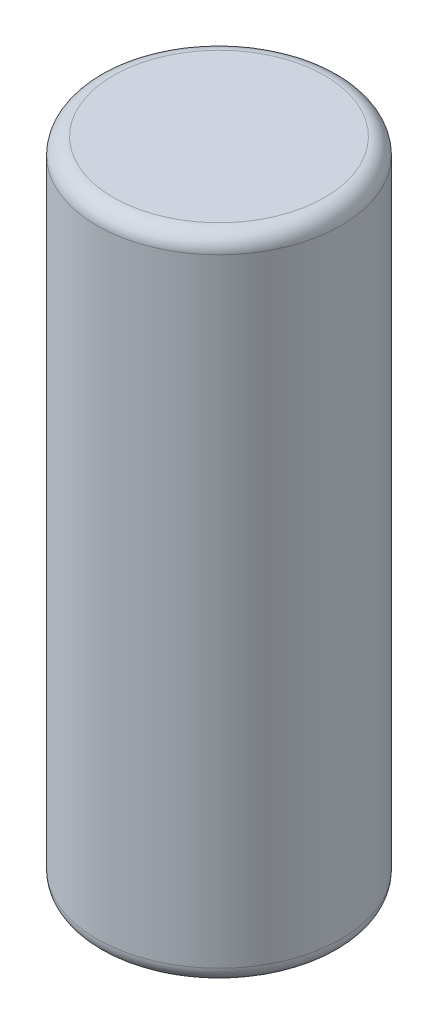
ISO-10303-21;
HEADER;
FILE_DESCRIPTION(('STEP AP214'),'2;1');
FILE_NAME('part.step','',(''),(''),'','','');
FILE_SCHEMA(('AUTOMOTIVE_DESIGN { 1 0 10303 214 1 1 1 1 }'));
ENDSEC;
DATA;
#1=APPLICATION_CONTEXT('core data for automotive mechanical design processes');
#2=APPLICATION_PROTOCOL_DEFINITION('international standard','automotive_design',2000,#1);
#3=PRODUCT_CONTEXT('',#1,'mechanical');
#4=PRODUCT('Part','Part','',(#3));
#5=PRODUCT_RELATED_PRODUCT_CATEGORY('part','',(#4));
#6=PRODUCT_DEFINITION_FORMATION('','',#4);
#7=PRODUCT_DEFINITION_CONTEXT('part definition',#1,'design');
#8=PRODUCT_DEFINITION('design','',#6,#7);
#9=PRODUCT_DEFINITION_SHAPE('','',#8);
#10=(LENGTH_UNIT() NAMED_UNIT(*) SI_UNIT(.MILLI.,.METRE.));
#11=(NAMED_UNIT(*) PLANE_ANGLE_UNIT() SI_UNIT($,.RADIAN.));
#12=(NAMED_UNIT(*) SI_UNIT($,.STERADIAN.) SOLID_ANGLE_UNIT());
#13=UNCERTAINTY_MEASURE_WITH_UNIT(LENGTH_MEASURE(1.E-05),#10,'distance_accuracy_value','');
#14=(GEOMETRIC_REPRESENTATION_CONTEXT(3) GLOBAL_UNCERTAINTY_ASSIGNED_CONTEXT((#13)) GLOBAL_UNIT_ASSIGNED_CONTEXT((#10,
#11,#12)) REPRESENTATION_CONTEXT('',''));
#15=CARTESIAN_POINT('',(0.,0.,0.));
#16=DIRECTION('',(0.,0.,1.));
#17=DIRECTION('',(1.,0.,0.));
#18=AXIS2_PLACEMENT_3D('',#15,#16,#17);
#19=CARTESIAN_POINT('',(0.,200.,0.));
#20=DIRECTION('',(0.,-1.,0.));
#21=DIRECTION('',(0.,0.,-1.));
#22=AXIS2_PLACEMENT_3D('',#19,#20,#21);
#23=CYLINDRICAL_SURFACE('',#22,75.);
#24=CARTESIAN_POINT('',(0.,-190.,0.));
#25=DIRECTION('',(0.,1.,0.));
#26=DIRECTION('',(0.,0.,1.));
#27=AXIS2_PLACEMENT_3D('',#24,#25,#26);
#28=CIRCLE('',#27,75.);
#29=CARTESIAN_POINT('',(0.,-190.,-75.));
#30=VERTEX_POINT('',#29);
#31=EDGE_CURVE('E45',#30,#30,#28,.T.);
#32=CARTESIAN_POINT('',(0.,190.,0.));
#33=DIRECTION('',(0.,1.,0.));
#34=DIRECTION('',(0.,0.,1.));
#35=AXIS2_PLACEMENT_3D('',#32,#33,#34);
#36=CIRCLE('',#35,75.);
#37=CARTESIAN_POINT('',(0.,190.,-75.));
#38=VERTEX_POINT('',#37);
#39=EDGE_CURVE('E49',#38,#38,#36,.F.);
#40=CARTESIAN_POINT('',(0.,-190.,-75.));
#41=CARTESIAN_POINT('',(0.,-186.041666666667,-75.));
#42=CARTESIAN_POINT('',(0.,-182.083333333334,-75.));
#43=CARTESIAN_POINT('',(0.,-174.166666666667,-75.));
#44=CARTESIAN_POINT('',(0.,-170.208333333333,-75.));
#45=CARTESIAN_POINT('',(0.,-162.291666666667,-75.));
#46=CARTESIAN_POINT('',(0.,-158.333333333333,-75.));
#47=CARTESIAN_POINT('',(0.,-150.416666666667,-75.));
#48=CARTESIAN_POINT('',(0.,-146.458333333333,-75.));
#49=CARTESIAN_POINT('',(0.,-138.541666666667,-75.));
#50=CARTESIAN_POINT('',(0.,-134.583333333333,-75.));
#51=CARTESIAN_POINT('',(0.,-126.666666666667,-75.));
#52=CARTESIAN_POINT('',(0.,-122.708333333333,-75.));
#53=CARTESIAN_POINT('',(0.,-114.791666666667,-75.));
#54=CARTESIAN_POINT('',(0.,-110.833333333333,-75.));
#55=CARTESIAN_POINT('',(0.,-102.916666666667,-75.));
#56=CARTESIAN_POINT('',(0.,-98.9583333333335,-75.));
#57=CARTESIAN_POINT('',(0.,-91.0416666666668,-75.));
#58=CARTESIAN_POINT('',(0.,-87.0833333333334,-75.));
#59=CARTESIAN_POINT('',(0.,-79.1666666666667,-75.));
#60=CARTESIAN_POINT('',(0.,-75.2083333333334,-75.));
#61=CARTESIAN_POINT('',(0.,-67.2916666666667,-75.));
#62=CARTESIAN_POINT('',(0.,-63.3333333333334,-75.));
#63=CARTESIAN_POINT('',(0.,-55.4166666666668,-75.));
#64=CARTESIAN_POINT('',(0.,-51.4583333333334,-75.));
#65=CARTESIAN_POINT('',(0.,-43.5416666666668,-75.));
#66=CARTESIAN_POINT('',(0.,-39.5833333333334,-75.));
#67=CARTESIAN_POINT('',(0.,-31.6666666666667,-75.));
#68=CARTESIAN_POINT('',(0.,-27.7083333333334,-75.));
#69=CARTESIAN_POINT('',(0.,-19.7916666666667,-75.));
#70=CARTESIAN_POINT('',(0.,-15.8333333333334,-75.));
#71=CARTESIAN_POINT('',(0.,-7.91666666666674,-75.));
#72=CARTESIAN_POINT('',(0.,-3.9583333333334,-75.));
#73=CARTESIAN_POINT('',(0.,3.95833333333328,-75.));
#74=CARTESIAN_POINT('',(0.,7.91666666666663,-75.));
#75=CARTESIAN_POINT('',(0.,15.8333333333333,-75.));
#76=CARTESIAN_POINT('',(0.,19.7916666666666,-75.));
#77=CARTESIAN_POINT('',(0.,27.7083333333333,-75.));
#78=CARTESIAN_POINT('',(0.,31.6666666666666,-75.));
#79=CARTESIAN_POINT('',(0.,39.5833333333333,-75.));
#80=CARTESIAN_POINT('',(0.,43.5416666666666,-75.));
#81=CARTESIAN_POINT('',(0.,51.4583333333333,-75.));
#82=CARTESIAN_POINT('',(0.,55.4166666666667,-75.));
#83=CARTESIAN_POINT('',(0.,63.3333333333333,-75.));
#84=CARTESIAN_POINT('',(0.,67.2916666666667,-75.));
#85=CARTESIAN_POINT('',(0.,75.2083333333333,-75.));
#86=CARTESIAN_POINT('',(0.,79.1666666666666,-75.));
#87=CARTESIAN_POINT('',(0.,87.0833333333333,-75.));
#88=CARTESIAN_POINT('',(0.,91.0416666666667,-75.));
#89=CARTESIAN_POINT('',(0.,98.9583333333334,-75.));
#90=CARTESIAN_POINT('',(0.,102.916666666667,-75.));
#91=CARTESIAN_POINT('',(0.,110.833333333333,-75.));
#92=CARTESIAN_POINT('',(0.,114.791666666667,-75.));
#93=CARTESIAN_POINT('',(0.,122.708333333333,-75.));
#94=CARTESIAN_POINT('',(0.,126.666666666667,-75.));
#95=CARTESIAN_POINT('',(0.,134.583333333333,-75.));
#96=CARTESIAN_POINT('',(0.,138.541666666667,-75.));
#97=CARTESIAN_POINT('',(0.,146.458333333333,-75.));
#98=CARTESIAN_POINT('',(0.,150.416666666667,-75.));
#99=CARTESIAN_POINT('',(0.,158.333333333333,-75.));
#100=CARTESIAN_POINT('',(0.,162.291666666667,-75.));
#101=CARTESIAN_POINT('',(0.,170.208333333333,-75.));
#102=CARTESIAN_POINT('',(0.,174.166666666667,-75.));
#103=CARTESIAN_POINT('',(0.,182.083333333333,-75.));
#104=CARTESIAN_POINT('',(0.,186.041666666667,-75.));
#105=CARTESIAN_POINT('',(0.,190.,-75.));
#106=B_SPLINE_CURVE_WITH_KNOTS('',3,(#40,#41,#42,#43,#44,#45,#46,#47,#48,#49,#50,#51,#52,#53,
#54,#55,#56,#57,#58,#59,#60,#61,#62,#63,#64,#65,#66,#67,#68,#69,#70,#71,#72,#73,#74,#75,#76,#77,
#78,#79,#80,#81,#82,#83,#84,#85,#86,#87,#88,#89,#90,#91,#92,#93,#94,#95,#96,#97,#98,#99,#100,
#101,#102,#103,#104,#105),.UNSPECIFIED.,.F.,.F.,(4,2,2,2,2,2,2,2,2,2,2,2,2,2,2,2,2,2,2,2,2,2,2,
2,2,2,2,2,2,2,2,2,4),(0.,11.875,23.75,35.625,47.5,59.3750000000001,71.25,83.1250000000001,
95.0000000000001,106.875,118.75,130.625,142.5,154.375,166.25,178.125,190.,201.875,213.75,
225.625,237.5,249.375,261.25,273.125,285.,296.875,308.75,320.625,332.5,344.375,356.25,368.125,
380.),.UNSPECIFIED.);
#107=EDGE_CURVE('BSEAM34',#30,#38,#106,.T.);
#108=ORIENTED_EDGE('',*,*,#31,.T.);
#109=ORIENTED_EDGE('',*,*,#39,.T.);
#110=ORIENTED_EDGE('',*,*,#107,.T.);
#111=ORIENTED_EDGE('',*,*,#107,.F.);
#112=EDGE_LOOP('',(#108,#110,#109,#111));
#113=FACE_BOUND('',#112,.T.);
#114=ADVANCED_FACE('F34',(#113),#23,.T.);
#115=CARTESIAN_POINT('',(0.,200.,0.));
#116=DIRECTION('',(0.,1.,0.));
#117=DIRECTION('',(0.,0.,1.));
#118=AXIS2_PLACEMENT_3D('',#115,#116,#117);
#119=PLANE('',#118);
#120=CARTESIAN_POINT('',(0.,200.,0.));
#121=DIRECTION('',(0.,1.,0.));
#122=DIRECTION('',(0.,0.,1.));
#123=AXIS2_PLACEMENT_3D('',#120,#121,#122);
#124=CIRCLE('',#123,65.);
#125=CARTESIAN_POINT('',(0.,200.,65.));
#126=VERTEX_POINT('',#125);
#127=EDGE_CURVE('E10',#126,#126,#124,.T.);
#128=ORIENTED_EDGE('',*,*,#127,.T.);
#129=EDGE_LOOP('',(#128));
#130=FACE_BOUND('',#129,.T.);
#131=ADVANCED_FACE('F65',(#130),#119,.T.);
#132=CARTESIAN_POINT('',(0.,-200.,0.));
#133=DIRECTION('',(0.,1.,0.));
#134=DIRECTION('',(0.,0.,1.));
#135=AXIS2_PLACEMENT_3D('',#132,#133,#134);
#136=PLANE('',#135);
#137=CARTESIAN_POINT('',(0.,-200.,0.));
#138=DIRECTION('',(0.,1.,0.));
#139=DIRECTION('',(0.,0.,1.));
#140=AXIS2_PLACEMENT_3D('',#137,#138,#139);
#141=CIRCLE('',#140,65.);
#142=CARTESIAN_POINT('',(0.,-200.,65.));
#143=VERTEX_POINT('',#142);
#144=EDGE_CURVE('E41',#143,#143,#141,.F.);
#145=ORIENTED_EDGE('',*,*,#144,.T.);
#146=EDGE_LOOP('',(#145));
#147=FACE_BOUND('',#146,.T.);
#148=ADVANCED_FACE('F62',(#147),#136,.F.);
#149=CARTESIAN_POINT('',(0.,-190.,0.));
#150=DIRECTION('',(0.,1.,0.));
#151=DIRECTION('',(0.,0.,1.));
#152=AXIS2_PLACEMENT_3D('',#149,#150,#151);
#153=TOROIDAL_SURFACE('',#152,65.,10.);
#154=ORIENTED_EDGE('',*,*,#144,.F.);
#155=EDGE_LOOP('',(#154));
#156=FACE_BOUND('',#155,.T.);
#157=ORIENTED_EDGE('',*,*,#31,.F.);
#158=EDGE_LOOP('',(#157));
#159=FACE_BOUND('',#158,.T.);
#160=ADVANCED_FACE('F58',(#156,#159),#153,.T.);
#161=CARTESIAN_POINT('',(0.,190.,0.));
#162=DIRECTION('',(0.,1.,0.));
#163=DIRECTION('',(0.,0.,1.));
#164=AXIS2_PLACEMENT_3D('',#161,#162,#163);
#165=TOROIDAL_SURFACE('',#164,65.,10.);
#166=ORIENTED_EDGE('',*,*,#39,.F.);
#167=EDGE_LOOP('',(#166));
#168=FACE_BOUND('',#167,.T.);
#169=ORIENTED_EDGE('',*,*,#127,.F.);
#170=EDGE_LOOP('',(#169));
#171=FACE_BOUND('',#170,.T.);
#172=ADVANCED_FACE('F36',(#168,#171),#165,.T.);
#173=CLOSED_SHELL('',(#114,#131,#148,#160,#172));
#174=MANIFOLD_SOLID_BREP('B2',#173);
#175=ADVANCED_BREP_SHAPE_REPRESENTATION('',(#18,#174),#14);
#176=SHAPE_DEFINITION_REPRESENTATION(#9,#175);
ENDSEC;
END-ISO-10303-21;
